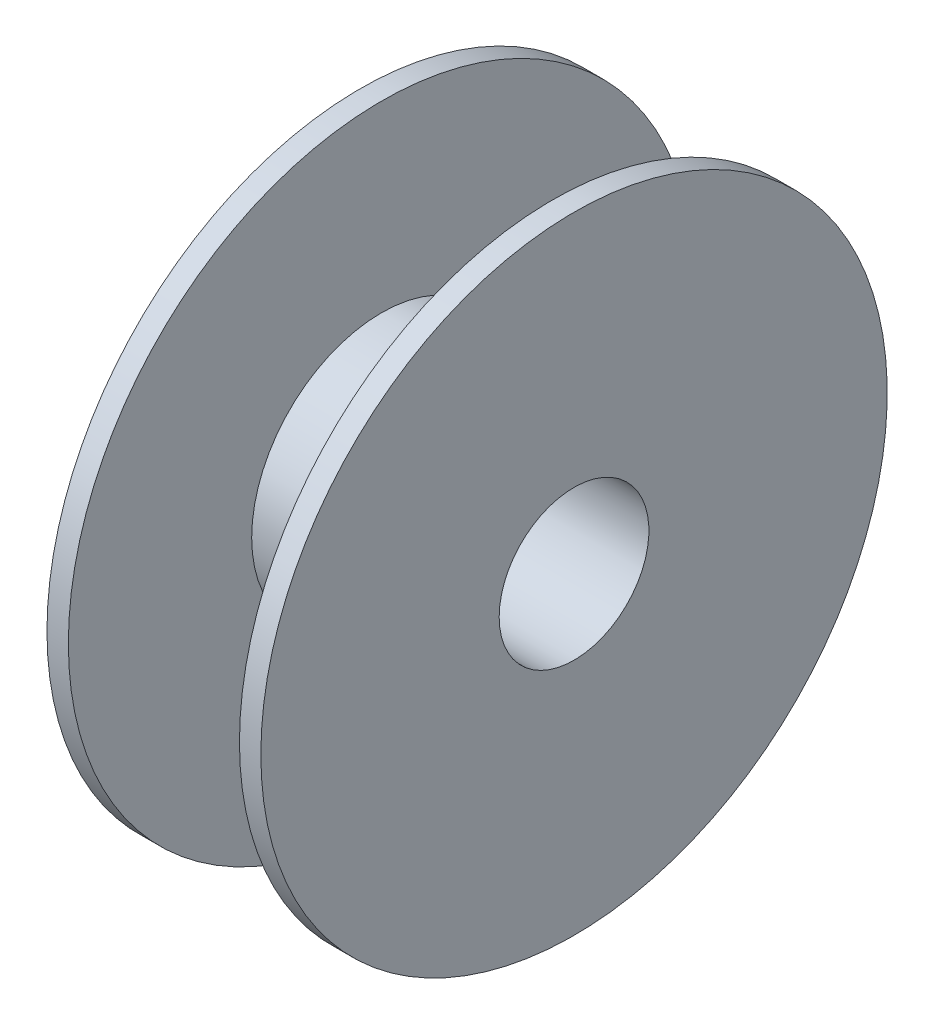
ISO-10303-21;
HEADER;
FILE_DESCRIPTION(('STEP AP214'),'2;1');
FILE_NAME('part.step','',(''),(''),'','','');
FILE_SCHEMA(('AUTOMOTIVE_DESIGN { 1 0 10303 214 1 1 1 1 }'));
ENDSEC;
DATA;
#1=APPLICATION_CONTEXT('core data for automotive mechanical design processes');
#2=APPLICATION_PROTOCOL_DEFINITION('international standard','automotive_design',2000,#1);
#3=PRODUCT_CONTEXT('',#1,'mechanical');
#4=PRODUCT('Part','Part','',(#3));
#5=PRODUCT_RELATED_PRODUCT_CATEGORY('part','',(#4));
#6=PRODUCT_DEFINITION_FORMATION('','',#4);
#7=PRODUCT_DEFINITION_CONTEXT('part definition',#1,'design');
#8=PRODUCT_DEFINITION('design','',#6,#7);
#9=PRODUCT_DEFINITION_SHAPE('','',#8);
#10=(LENGTH_UNIT() NAMED_UNIT(*) SI_UNIT(.MILLI.,.METRE.));
#11=(NAMED_UNIT(*) PLANE_ANGLE_UNIT() SI_UNIT($,.RADIAN.));
#12=(NAMED_UNIT(*) SI_UNIT($,.STERADIAN.) SOLID_ANGLE_UNIT());
#13=UNCERTAINTY_MEASURE_WITH_UNIT(LENGTH_MEASURE(1.E-05),#10,'distance_accuracy_value','');
#14=(GEOMETRIC_REPRESENTATION_CONTEXT(3) GLOBAL_UNCERTAINTY_ASSIGNED_CONTEXT((#13)) GLOBAL_UNIT_ASSIGNED_CONTEXT((#10,
#11,#12)) REPRESENTATION_CONTEXT('',''));
#15=CARTESIAN_POINT('',(0.,0.,0.));
#16=DIRECTION('',(0.,0.,1.));
#17=DIRECTION('',(1.,0.,0.));
#18=AXIS2_PLACEMENT_3D('',#15,#16,#17);
#19=CARTESIAN_POINT('',(-72.7317073170732,0.,0.));
#20=DIRECTION('',(-1.,0.,0.));
#21=DIRECTION('',(0.,0.,1.));
#22=AXIS2_PLACEMENT_3D('',#19,#20,#21);
#23=CYLINDRICAL_SURFACE('',#22,102.5);
#24=CARTESIAN_POINT('',(-35.,0.,0.));
#25=DIRECTION('',(-1.,0.,0.));
#26=DIRECTION('',(0.,0.,1.));
#27=AXIS2_PLACEMENT_3D('',#24,#25,#26);
#28=CIRCLE('',#27,102.5);
#29=CARTESIAN_POINT('',(-35.,0.,102.5));
#30=VERTEX_POINT('',#29);
#31=EDGE_CURVE('E10',#30,#30,#28,.T.);
#32=ORIENTED_EDGE('',*,*,#31,.F.);
#33=EDGE_LOOP('',(#32));
#34=FACE_BOUND('',#33,.T.);
#35=CARTESIAN_POINT('',(-28.,0.,0.));
#36=DIRECTION('',(-1.,0.,0.));
#37=DIRECTION('',(0.,0.,1.));
#38=AXIS2_PLACEMENT_3D('',#35,#36,#37);
#39=CIRCLE('',#38,102.5);
#40=CARTESIAN_POINT('',(-28.,0.,102.5));
#41=VERTEX_POINT('',#40);
#42=EDGE_CURVE('E70',#41,#41,#39,.T.);
#43=ORIENTED_EDGE('',*,*,#42,.T.);
#44=EDGE_LOOP('',(#43));
#45=FACE_BOUND('',#44,.T.);
#46=ADVANCED_FACE('F36',(#34,#45),#23,.T.);
#47=CARTESIAN_POINT('',(-35.,0.,-102.5));
#48=DIRECTION('',(1.,0.,0.));
#49=DIRECTION('',(0.,0.,-1.));
#50=AXIS2_PLACEMENT_3D('',#47,#48,#49);
#51=PLANE('',#50);
#52=CARTESIAN_POINT('',(-35.,0.,0.));
#53=DIRECTION('',(-1.,0.,0.));
#54=DIRECTION('',(0.,0.,1.));
#55=AXIS2_PLACEMENT_3D('',#52,#53,#54);
#56=CIRCLE('',#55,24.5);
#57=CARTESIAN_POINT('',(-35.,0.,24.5));
#58=VERTEX_POINT('',#57);
#59=EDGE_CURVE('E43',#58,#58,#56,.T.);
#60=ORIENTED_EDGE('',*,*,#59,.F.);
#61=EDGE_LOOP('',(#60));
#62=FACE_BOUND('',#61,.T.);
#63=ORIENTED_EDGE('',*,*,#31,.T.);
#64=EDGE_LOOP('',(#63));
#65=FACE_BOUND('',#64,.T.);
#66=ADVANCED_FACE('F107',(#62,#65),#51,.F.);
#67=CARTESIAN_POINT('',(-72.7317073170732,0.,0.));
#68=DIRECTION('',(-1.,0.,0.));
#69=DIRECTION('',(0.,0.,1.));
#70=AXIS2_PLACEMENT_3D('',#67,#68,#69);
#71=CYLINDRICAL_SURFACE('',#70,24.5);
#72=CARTESIAN_POINT('',(35.,0.,0.));
#73=DIRECTION('',(-1.,0.,0.));
#74=DIRECTION('',(0.,0.,1.));
#75=AXIS2_PLACEMENT_3D('',#72,#73,#74);
#76=CIRCLE('',#75,24.5);
#77=CARTESIAN_POINT('',(35.,0.,24.5));
#78=VERTEX_POINT('',#77);
#79=EDGE_CURVE('E49',#78,#78,#76,.T.);
#80=ORIENTED_EDGE('',*,*,#79,.F.);
#81=EDGE_LOOP('',(#80));
#82=FACE_BOUND('',#81,.T.);
#83=ORIENTED_EDGE('',*,*,#59,.T.);
#84=EDGE_LOOP('',(#83));
#85=FACE_BOUND('',#84,.T.);
#86=ADVANCED_FACE('F102',(#82,#85),#71,.F.);
#87=CARTESIAN_POINT('',(35.,0.,-24.5));
#88=DIRECTION('',(-1.,0.,0.));
#89=DIRECTION('',(0.,0.,1.));
#90=AXIS2_PLACEMENT_3D('',#87,#88,#89);
#91=PLANE('',#90);
#92=CARTESIAN_POINT('',(35.,0.,0.));
#93=DIRECTION('',(-1.,0.,0.));
#94=DIRECTION('',(0.,0.,1.));
#95=AXIS2_PLACEMENT_3D('',#92,#93,#94);
#96=CIRCLE('',#95,102.5);
#97=CARTESIAN_POINT('',(35.,0.,102.5));
#98=VERTEX_POINT('',#97);
#99=EDGE_CURVE('E54',#98,#98,#96,.T.);
#100=ORIENTED_EDGE('',*,*,#99,.F.);
#101=EDGE_LOOP('',(#100));
#102=FACE_BOUND('',#101,.T.);
#103=ORIENTED_EDGE('',*,*,#79,.T.);
#104=EDGE_LOOP('',(#103));
#105=FACE_BOUND('',#104,.T.);
#106=ADVANCED_FACE('F96',(#102,#105),#91,.F.);
#107=CARTESIAN_POINT('',(-72.7317073170732,0.,0.));
#108=DIRECTION('',(-1.,0.,0.));
#109=DIRECTION('',(0.,0.,1.));
#110=AXIS2_PLACEMENT_3D('',#107,#108,#109);
#111=CYLINDRICAL_SURFACE('',#110,102.5);
#112=CARTESIAN_POINT('',(28.,0.,0.));
#113=DIRECTION('',(-1.,0.,0.));
#114=DIRECTION('',(0.,0.,1.));
#115=AXIS2_PLACEMENT_3D('',#112,#113,#114);
#116=CIRCLE('',#115,102.5);
#117=CARTESIAN_POINT('',(28.,0.,102.5));
#118=VERTEX_POINT('',#117);
#119=EDGE_CURVE('E60',#118,#118,#116,.T.);
#120=ORIENTED_EDGE('',*,*,#119,.F.);
#121=EDGE_LOOP('',(#120));
#122=FACE_BOUND('',#121,.T.);
#123=ORIENTED_EDGE('',*,*,#99,.T.);
#124=EDGE_LOOP('',(#123));
#125=FACE_BOUND('',#124,.T.);
#126=ADVANCED_FACE('F90',(#122,#125),#111,.T.);
#127=CARTESIAN_POINT('',(28.,0.,-102.5));
#128=DIRECTION('',(1.,0.,0.));
#129=DIRECTION('',(0.,0.,-1.));
#130=AXIS2_PLACEMENT_3D('',#127,#128,#129);
#131=PLANE('',#130);
#132=CARTESIAN_POINT('',(28.,0.,0.));
#133=DIRECTION('',(-1.,0.,0.));
#134=DIRECTION('',(0.,0.,1.));
#135=AXIS2_PLACEMENT_3D('',#132,#133,#134);
#136=CIRCLE('',#135,42.5);
#137=CARTESIAN_POINT('',(28.,0.,42.5));
#138=VERTEX_POINT('',#137);
#139=EDGE_CURVE('E63',#138,#138,#136,.T.);
#140=ORIENTED_EDGE('',*,*,#139,.F.);
#141=EDGE_LOOP('',(#140));
#142=FACE_BOUND('',#141,.T.);
#143=ORIENTED_EDGE('',*,*,#119,.T.);
#144=EDGE_LOOP('',(#143));
#145=FACE_BOUND('',#144,.T.);
#146=ADVANCED_FACE('F84',(#142,#145),#131,.F.);
#147=CARTESIAN_POINT('',(-72.7317073170732,0.,0.));
#148=DIRECTION('',(-1.,0.,0.));
#149=DIRECTION('',(0.,0.,1.));
#150=AXIS2_PLACEMENT_3D('',#147,#148,#149);
#151=CYLINDRICAL_SURFACE('',#150,42.5);
#152=CARTESIAN_POINT('',(-28.,0.,0.));
#153=DIRECTION('',(-1.,0.,0.));
#154=DIRECTION('',(0.,0.,1.));
#155=AXIS2_PLACEMENT_3D('',#152,#153,#154);
#156=CIRCLE('',#155,42.5);
#157=CARTESIAN_POINT('',(-28.,0.,42.5));
#158=VERTEX_POINT('',#157);
#159=EDGE_CURVE('E67',#158,#158,#156,.T.);
#160=ORIENTED_EDGE('',*,*,#159,.F.);
#161=EDGE_LOOP('',(#160));
#162=FACE_BOUND('',#161,.T.);
#163=ORIENTED_EDGE('',*,*,#139,.T.);
#164=EDGE_LOOP('',(#163));
#165=FACE_BOUND('',#164,.T.);
#166=ADVANCED_FACE('F78',(#162,#165),#151,.T.);
#167=CARTESIAN_POINT('',(-28.,0.,-42.5));
#168=DIRECTION('',(-1.,0.,0.));
#169=DIRECTION('',(0.,0.,1.));
#170=AXIS2_PLACEMENT_3D('',#167,#168,#169);
#171=PLANE('',#170);
#172=ORIENTED_EDGE('',*,*,#42,.F.);
#173=EDGE_LOOP('',(#172));
#174=FACE_BOUND('',#173,.T.);
#175=ORIENTED_EDGE('',*,*,#159,.T.);
#176=EDGE_LOOP('',(#175));
#177=FACE_BOUND('',#176,.T.);
#178=ADVANCED_FACE('F75',(#174,#177),#171,.F.);
#179=CLOSED_SHELL('',(#46,#66,#86,#106,#126,#146,#166,#178));
#180=MANIFOLD_SOLID_BREP('B2',#179);
#181=ADVANCED_BREP_SHAPE_REPRESENTATION('',(#18,#180),#14);
#182=SHAPE_DEFINITION_REPRESENTATION(#9,#181);
ENDSEC;
END-ISO-10303-21;
